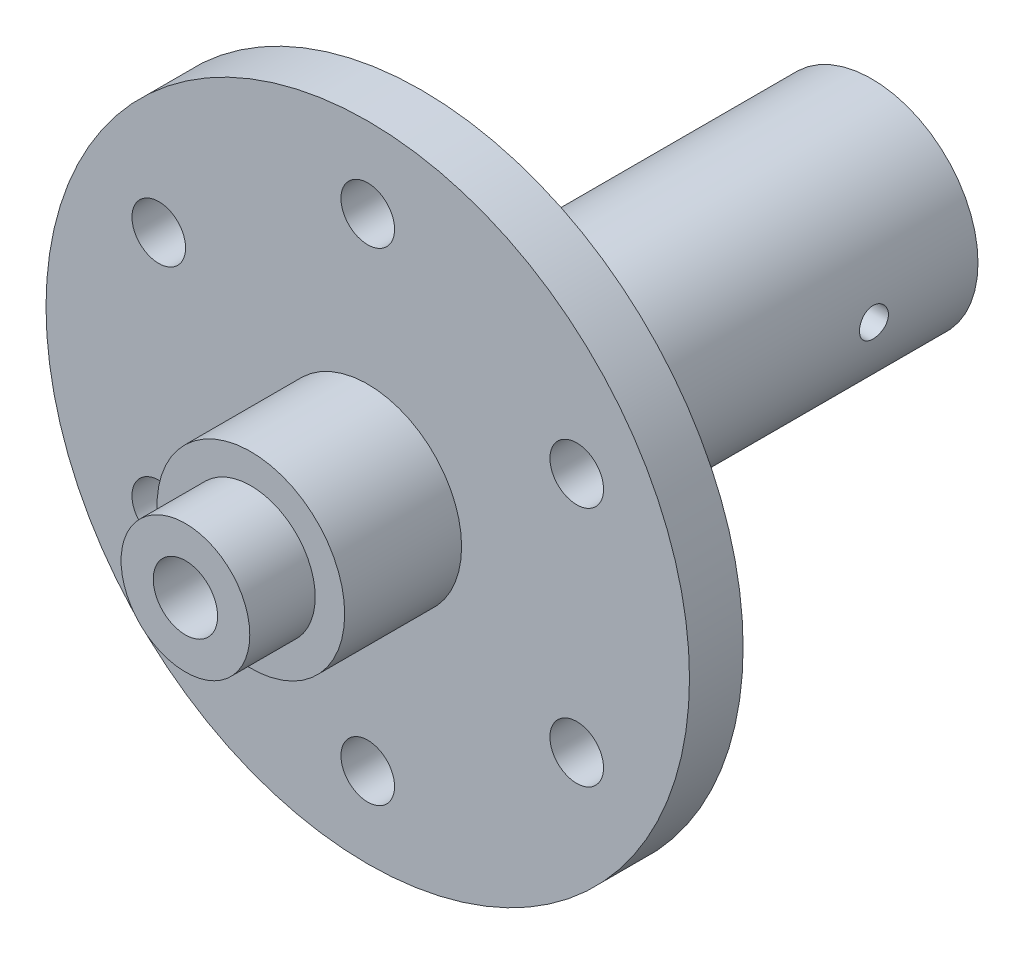
ISO-10303-21;
HEADER;
FILE_DESCRIPTION(('STEP AP214'),'2;1');
FILE_NAME('part.step','',(''),(''),'','','');
FILE_SCHEMA(('AUTOMOTIVE_DESIGN { 1 0 10303 214 1 1 1 1 }'));
ENDSEC;
DATA;
#1=APPLICATION_CONTEXT('core data for automotive mechanical design processes');
#2=APPLICATION_PROTOCOL_DEFINITION('international standard','automotive_design',2000,#1);
#3=PRODUCT_CONTEXT('',#1,'mechanical');
#4=PRODUCT('Part','Part','',(#3));
#5=PRODUCT_RELATED_PRODUCT_CATEGORY('part','',(#4));
#6=PRODUCT_DEFINITION_FORMATION('','',#4);
#7=PRODUCT_DEFINITION_CONTEXT('part definition',#1,'design');
#8=PRODUCT_DEFINITION('design','',#6,#7);
#9=PRODUCT_DEFINITION_SHAPE('','',#8);
#10=(LENGTH_UNIT() NAMED_UNIT(*) SI_UNIT(.MILLI.,.METRE.));
#11=(NAMED_UNIT(*) PLANE_ANGLE_UNIT() SI_UNIT($,.RADIAN.));
#12=(NAMED_UNIT(*) SI_UNIT($,.STERADIAN.) SOLID_ANGLE_UNIT());
#13=UNCERTAINTY_MEASURE_WITH_UNIT(LENGTH_MEASURE(1.E-05),#10,'distance_accuracy_value','');
#14=(GEOMETRIC_REPRESENTATION_CONTEXT(3) GLOBAL_UNCERTAINTY_ASSIGNED_CONTEXT((#13)) GLOBAL_UNIT_ASSIGNED_CONTEXT((#10,
#11,#12)) REPRESENTATION_CONTEXT('',''));
#15=CARTESIAN_POINT('',(0.,0.,0.));
#16=DIRECTION('',(0.,0.,1.));
#17=DIRECTION('',(1.,0.,0.));
#18=AXIS2_PLACEMENT_3D('',#15,#16,#17);
#19=CARTESIAN_POINT('',(-30.36,-30.36,5.));
#20=DIRECTION('',(0.,0.,1.));
#21=DIRECTION('',(1.,0.,0.));
#22=AXIS2_PLACEMENT_3D('',#19,#20,#21);
#23=PLANE('',#22);
#24=CARTESIAN_POINT('',(0.,0.,5.));
#25=DIRECTION('',(0.,0.,-1.));
#26=DIRECTION('',(0.,1.,0.));
#27=AXIS2_PLACEMENT_3D('',#24,#25,#26);
#28=CIRCLE('',#27,30.);
#29=CARTESIAN_POINT('',(0.,30.,5.));
#30=VERTEX_POINT('',#29);
#31=EDGE_CURVE('E123',#30,#30,#28,.F.);
#32=ORIENTED_EDGE('',*,*,#31,.T.);
#33=EDGE_LOOP('',(#32));
#34=FACE_BOUND('',#33,.T.);
#35=CARTESIAN_POINT('',(0.,-22.5,5.));
#36=DIRECTION('',(0.,0.,1.));
#37=DIRECTION('',(1.,0.,0.));
#38=AXIS2_PLACEMENT_3D('',#35,#36,#37);
#39=CIRCLE('',#38,2.5);
#40=CARTESIAN_POINT('',(2.5,-22.5,5.));
#41=VERTEX_POINT('',#40);
#42=EDGE_CURVE('E120',#41,#41,#39,.T.);
#43=ORIENTED_EDGE('',*,*,#42,.F.);
#44=EDGE_LOOP('',(#43));
#45=FACE_BOUND('',#44,.T.);
#46=CARTESIAN_POINT('',(-19.485571585,11.25,5.));
#47=DIRECTION('',(0.,0.,1.));
#48=DIRECTION('',(1.,0.,0.));
#49=AXIS2_PLACEMENT_3D('',#46,#47,#48);
#50=CIRCLE('',#49,2.5);
#51=CARTESIAN_POINT('',(-16.985571585,11.25,5.));
#52=VERTEX_POINT('',#51);
#53=EDGE_CURVE('E117',#52,#52,#50,.T.);
#54=ORIENTED_EDGE('',*,*,#53,.F.);
#55=EDGE_LOOP('',(#54));
#56=FACE_BOUND('',#55,.T.);
#57=CARTESIAN_POINT('',(19.485571585,-11.25,5.));
#58=DIRECTION('',(0.,0.,1.));
#59=DIRECTION('',(1.,0.,0.));
#60=AXIS2_PLACEMENT_3D('',#57,#58,#59);
#61=CIRCLE('',#60,2.5);
#62=CARTESIAN_POINT('',(21.985571585,-11.25,5.));
#63=VERTEX_POINT('',#62);
#64=EDGE_CURVE('E114',#63,#63,#61,.T.);
#65=ORIENTED_EDGE('',*,*,#64,.F.);
#66=EDGE_LOOP('',(#65));
#67=FACE_BOUND('',#66,.T.);
#68=CARTESIAN_POINT('',(0.,22.5,5.));
#69=DIRECTION('',(0.,0.,1.));
#70=DIRECTION('',(1.,0.,0.));
#71=AXIS2_PLACEMENT_3D('',#68,#69,#70);
#72=CIRCLE('',#71,2.5);
#73=CARTESIAN_POINT('',(2.5,22.5,5.));
#74=VERTEX_POINT('',#73);
#75=EDGE_CURVE('E111',#74,#74,#72,.T.);
#76=ORIENTED_EDGE('',*,*,#75,.F.);
#77=EDGE_LOOP('',(#76));
#78=FACE_BOUND('',#77,.T.);
#79=CARTESIAN_POINT('',(-19.485571585,-11.25,5.));
#80=DIRECTION('',(0.,0.,1.));
#81=DIRECTION('',(1.,0.,0.));
#82=AXIS2_PLACEMENT_3D('',#79,#80,#81);
#83=CIRCLE('',#82,2.5);
#84=CARTESIAN_POINT('',(-16.985571585,-11.25,5.));
#85=VERTEX_POINT('',#84);
#86=EDGE_CURVE('E108',#85,#85,#83,.T.);
#87=ORIENTED_EDGE('',*,*,#86,.F.);
#88=EDGE_LOOP('',(#87));
#89=FACE_BOUND('',#88,.T.);
#90=CARTESIAN_POINT('',(19.485571585,11.25,5.));
#91=DIRECTION('',(0.,0.,1.));
#92=DIRECTION('',(1.,0.,0.));
#93=AXIS2_PLACEMENT_3D('',#90,#91,#92);
#94=CIRCLE('',#93,2.5);
#95=CARTESIAN_POINT('',(21.985571585,11.25,5.));
#96=VERTEX_POINT('',#95);
#97=EDGE_CURVE('E105',#96,#96,#94,.T.);
#98=ORIENTED_EDGE('',*,*,#97,.F.);
#99=EDGE_LOOP('',(#98));
#100=FACE_BOUND('',#99,.T.);
#101=CARTESIAN_POINT('',(0.,0.,5.));
#102=DIRECTION('',(0.,0.,1.));
#103=DIRECTION('',(1.,0.,0.));
#104=AXIS2_PLACEMENT_3D('',#101,#102,#103);
#105=CIRCLE('',#104,8.75);
#106=CARTESIAN_POINT('',(8.75000000000001,0.,5.));
#107=VERTEX_POINT('',#106);
#108=EDGE_CURVE('E141',#107,#107,#105,.T.);
#109=ORIENTED_EDGE('',*,*,#108,.F.);
#110=EDGE_LOOP('',(#109));
#111=FACE_BOUND('',#110,.T.);
#112=ADVANCED_FACE('F35',(#34,#45,#56,#67,#78,#89,#100,#111),#23,.T.);
#113=CARTESIAN_POINT('',(0.,0.,5.));
#114=DIRECTION('',(0.,0.,1.));
#115=DIRECTION('',(0.,-1.,0.));
#116=AXIS2_PLACEMENT_3D('',#113,#114,#115);
#117=CYLINDRICAL_SURFACE('',#116,5.);
#118=DIRECTION('',(0.,0.,1.));
#119=VECTOR('',#118,1.);
#120=CARTESIAN_POINT('',(3.99999999968993,3.00000000041343,-42.));
#121=LINE('',#120,#119);
#122=CARTESIAN_POINT('',(3.99999999968993,3.00000000041343,-42.));
#123=VERTEX_POINT('',#122);
#124=CARTESIAN_POINT('',(3.99999999968993,3.00000000041343,-20.));
#125=VERTEX_POINT('',#124);
#126=EDGE_CURVE('E71',#123,#125,#121,.T.);
#127=ORIENTED_EDGE('',*,*,#126,.T.);
#128=CARTESIAN_POINT('',(0.,0.,-20.));
#129=DIRECTION('',(0.,0.,1.));
#130=DIRECTION('',(1.,0.,0.));
#131=AXIS2_PLACEMENT_3D('',#128,#129,#130);
#132=CIRCLE('',#131,5.);
#133=CARTESIAN_POINT('',(3.99999999942055,-3.0000000007726,-20.));
#134=VERTEX_POINT('',#133);
#135=EDGE_CURVE('E49',#125,#134,#132,.T.);
#136=ORIENTED_EDGE('',*,*,#135,.T.);
#137=DIRECTION('',(0.,0.,1.));
#138=VECTOR('',#137,1.);
#139=CARTESIAN_POINT('',(3.99999999942055,-3.0000000007726,-42.));
#140=LINE('',#139,#138);
#141=CARTESIAN_POINT('',(3.99999999942055,-3.0000000007726,-42.));
#142=VERTEX_POINT('',#141);
#143=EDGE_CURVE('E69',#142,#134,#140,.T.);
#144=ORIENTED_EDGE('',*,*,#143,.F.);
#145=CARTESIAN_POINT('',(0.,0.,-42.));
#146=DIRECTION('',(0.,0.,1.));
#147=DIRECTION('',(1.,0.,0.));
#148=AXIS2_PLACEMENT_3D('',#145,#146,#147);
#149=CIRCLE('',#148,5.);
#150=EDGE_CURVE('E57',#123,#142,#149,.T.);
#151=ORIENTED_EDGE('',*,*,#150,.F.);
#152=EDGE_LOOP('',(#127,#136,#144,#151));
#153=FACE_BOUND('',#152,.T.);
#154=CARTESIAN_POINT('',(-4.81430161076521,1.35000000021612,-32.3004));
#155=CARTESIAN_POINT('',(-4.81430286394878,1.34999827971691,-32.3747315823983));
#156=CARTESIAN_POINT('',(-4.81604192341821,1.34383999346028,-32.4490812209438));
#157=CARTESIAN_POINT('',(-4.82278880598046,1.31941781697971,-32.5956307548145));
#158=CARTESIAN_POINT('',(-4.82779821537384,1.30114805195241,-32.667829589101));
#159=CARTESIAN_POINT('',(-4.84047800968983,1.25314927820912,-32.8079362165503));
#160=CARTESIAN_POINT('',(-4.84814458741225,1.22343665812198,-32.8758499856834));
#161=CARTESIAN_POINT('',(-4.86527000640674,1.1534472112701,-33.0057400337567));
#162=CARTESIAN_POINT('',(-4.87472899967937,1.11316948845133,-33.067715808471));
#163=CARTESIAN_POINT('',(-4.89464524575246,1.02208874803816,-33.1855596541482));
#164=CARTESIAN_POINT('',(-4.90512055048185,0.971063477685963,-33.2412529330843));
#165=CARTESIAN_POINT('',(-4.92573346298987,0.860413894712616,-33.3434045809951));
#166=CARTESIAN_POINT('',(-4.93587103491721,0.800788672739945,-33.3898619721379));
#167=CARTESIAN_POINT('',(-4.95486803593727,0.673416712616414,-33.4729548187037));
#168=CARTESIAN_POINT('',(-4.96370368888867,0.605552481827099,-33.5094160794056));
#169=CARTESIAN_POINT('',(-4.97889393890284,0.464378551427537,-33.5703449097957));
#170=CARTESIAN_POINT('',(-4.98524896522513,0.391069796579459,-33.5948145547579));
#171=CARTESIAN_POINT('',(-4.99463427073677,0.242912677048861,-33.6304986374292));
#172=CARTESIAN_POINT('',(-4.99773903427427,0.168140751372819,-33.6420105085242));
#173=CARTESIAN_POINT('',(-5.00053459517465,0.0176667620460513,-33.652388490739));
#174=CARTESIAN_POINT('',(-5.00022597775716,-0.0580351399383997,-33.6512567695858));
#175=CARTESIAN_POINT('',(-4.99628394181706,-0.206148379146274,-33.6365882168669));
#176=CARTESIAN_POINT('',(-4.99273667294193,-0.278594192255634,-33.6233728036255));
#177=CARTESIAN_POINT('',(-4.9828178523946,-0.420198991039629,-33.5854318141791));
#178=CARTESIAN_POINT('',(-4.97644613767504,-0.489357786708727,-33.5607055734822));
#179=CARTESIAN_POINT('',(-4.96146740611882,-0.623240499431479,-33.5002012573594));
#180=CARTESIAN_POINT('',(-4.95283843209469,-0.687912484550364,-33.4643139273697));
#181=CARTESIAN_POINT('',(-4.93427357589745,-0.810425309308604,-33.3825902231744));
#182=CARTESIAN_POINT('',(-4.92433743361614,-0.868264785015195,-33.3367518676705));
#183=CARTESIAN_POINT('',(-4.90386504530922,-0.977389368577139,-33.2347246747745));
#184=CARTESIAN_POINT('',(-4.89331975390705,-1.02841112295466,-33.178255646644));
#185=CARTESIAN_POINT('',(-4.87309871985228,-1.12032576120185,-33.05745407588));
#186=CARTESIAN_POINT('',(-4.86342303303649,-1.16121799495637,-32.9931210289274));
#187=CARTESIAN_POINT('',(-4.84599972165287,-1.23192009263183,-32.8578350851013));
#188=CARTESIAN_POINT('',(-4.83826495492739,-1.26165666485418,-32.7868421121628));
#189=CARTESIAN_POINT('',(-4.82575813869753,-1.30868526983732,-32.6406031190618));
#190=CARTESIAN_POINT('',(-4.82098533319036,-1.32598047827686,-32.5653581895109));
#191=CARTESIAN_POINT('',(-4.81510437101878,-1.34717781685081,-32.4152183648038));
#192=CARTESIAN_POINT('',(-4.81388856469176,-1.35147350921993,-32.3403831903031));
#193=CARTESIAN_POINT('',(-4.81496442602068,-1.3476356241933,-32.1910634834604));
#194=CARTESIAN_POINT('',(-4.81725570969025,-1.33950340751207,-32.1165789136269));
#195=CARTESIAN_POINT('',(-4.82498343552624,-1.31138786804745,-31.9716027701404));
#196=CARTESIAN_POINT('',(-4.83035662118218,-1.29164270168572,-31.9010613090276));
#197=CARTESIAN_POINT('',(-4.84358057255287,-1.24113031958282,-31.7642918346376));
#198=CARTESIAN_POINT('',(-4.85143166777493,-1.2103616378837,-31.6980643964441));
#199=CARTESIAN_POINT('',(-4.86894659996756,-1.13788170222456,-31.5701606919066));
#200=CARTESIAN_POINT('',(-4.87864718962229,-1.09594020593687,-31.5086200482754));
#201=CARTESIAN_POINT('',(-4.89868236925265,-1.00258944509475,-31.3933058237614));
#202=CARTESIAN_POINT('',(-4.90901708126084,-0.95117835434602,-31.3395337446074));
#203=CARTESIAN_POINT('',(-4.92952783932558,-0.838524492135215,-31.239641046785));
#204=CARTESIAN_POINT('',(-4.93969004119957,-0.777034931652404,-31.1937953280814));
#205=CARTESIAN_POINT('',(-4.95839615108514,-0.647005001729556,-31.1130756697437));
#206=CARTESIAN_POINT('',(-4.96694014524872,-0.578465007948501,-31.0782011459472));
#207=CARTESIAN_POINT('',(-4.98139207314967,-0.436762281090105,-31.0207367642324));
#208=CARTESIAN_POINT('',(-4.98731971513465,-0.363639019110184,-30.9980547706832));
#209=CARTESIAN_POINT('',(-4.99595786013535,-0.214434383633308,-30.9653542568033));
#210=CARTESIAN_POINT('',(-4.99866909541368,-0.138353687515078,-30.9553328540679));
#211=CARTESIAN_POINT('',(-5.00053340347862,0.012040739540617,-30.9484223339653));
#212=CARTESIAN_POINT('',(-4.99979560961114,0.0863348693302916,-30.9511304475152));
#213=CARTESIAN_POINT('',(-4.9950925506781,0.233369155458227,-30.9686642677354));
#214=CARTESIAN_POINT('',(-4.99112741227251,0.306109372666173,-30.9834894988588));
#215=CARTESIAN_POINT('',(-4.98043780455775,0.447473612222866,-31.0246067106959));
#216=CARTESIAN_POINT('',(-4.97373345825575,0.516123555072634,-31.0508151537865));
#217=CARTESIAN_POINT('',(-4.95826558945786,0.648090737389069,-31.1138803569012));
#218=CARTESIAN_POINT('',(-4.94950177267119,0.711407212964617,-31.1507386389211));
#219=CARTESIAN_POINT('',(-4.93055366445352,0.832777843171191,-31.2352258248417));
#220=CARTESIAN_POINT('',(-4.92033721707041,0.890641992186854,-31.2831204470282));
#221=CARTESIAN_POINT('',(-4.89976261729472,0.997648040240388,-31.3878192585778));
#222=CARTESIAN_POINT('',(-4.88940442802242,1.04678762090709,-31.4446258085679));
#223=CARTESIAN_POINT('',(-4.86944773346185,1.13605588603213,-31.5670873168881));
#224=CARTESIAN_POINT('',(-4.85987181512871,1.17595465944405,-31.6329138859785));
#225=CARTESIAN_POINT('',(-4.84288629979928,1.24406289798214,-31.7705912328054));
#226=CARTESIAN_POINT('',(-4.83547532076067,1.27227982532403,-31.8424381294499));
#227=CARTESIAN_POINT('',(-4.82466037217815,1.31263646017289,-31.9783907221685));
#228=CARTESIAN_POINT('',(-4.82080774030971,1.32661438042155,-32.0419208716674));
#229=CARTESIAN_POINT('',(-4.81562796422291,1.34529634267034,-32.1704295300676));
#230=CARTESIAN_POINT('',(-4.81430051503879,1.35000150454197,-32.2354078631131));
#231=CARTESIAN_POINT('',(-4.81430161076521,1.35000000021612,-32.3004));
#232=B_SPLINE_CURVE_WITH_KNOTS('',3,(#154,#155,#156,#157,#158,#159,#160,#161,#162,#163,#164,
#165,#166,#167,#168,#169,#170,#171,#172,#173,#174,#175,#176,#177,#178,#179,#180,#181,#182,#183,
#184,#185,#186,#187,#188,#189,#190,#191,#192,#193,#194,#195,#196,#197,#198,#199,#200,#201,#202,
#203,#204,#205,#206,#207,#208,#209,#210,#211,#212,#213,#214,#215,#216,#217,#218,#219,#220,#221,
#222,#223,#224,#225,#226,#227,#228,#229,#230,#231),.UNSPECIFIED.,.T.,.F.,(4,2,2,2,2,2,2,2,2,2,2,
2,2,2,2,2,2,2,2,2,2,2,2,2,2,2,2,2,2,2,2,2,2,2,2,2,2,2,4),(0.,0.222755692343451,
0.445619513874613,0.668165326449917,0.890730019824896,1.11845165869997,1.34619739434281,
1.57769059856956,1.8091437263254,2.03516823266293,2.26115398799988,2.48129819326814,
2.70145510849998,2.9238388082141,3.1462668262969,3.37569041153007,3.60512871741316,
3.83604905822631,4.06691043530417,4.29070879096954,4.51448264501875,4.7338199612218,
4.95318645674709,5.17747977382431,5.4018163908385,5.63282035090824,5.86381200906635,
6.09303267142768,6.3222011382911,6.54416828930886,6.76612672945205,6.9864831070752,
7.20687099198435,7.43325409621117,7.65969726726047,7.89128155572097,8.12271768195437,
8.31750860033477,8.51227599236394),.UNSPECIFIED.);
#233=CARTESIAN_POINT('',(-4.81430161076521,1.35000000021612,-32.3004));
#234=VERTEX_POINT('',#233);
#235=EDGE_CURVE('E175',#234,#234,#232,.T.);
#236=ORIENTED_EDGE('',*,*,#235,.T.);
#237=EDGE_LOOP('',(#236));
#238=FACE_BOUND('',#237,.T.);
#239=ADVANCED_FACE('F67',(#153,#238),#117,.F.);
#240=CARTESIAN_POINT('',(0.,0.,-42.));
#241=DIRECTION('',(0.,0.,1.));
#242=DIRECTION('',(1.,0.,0.));
#243=AXIS2_PLACEMENT_3D('',#240,#241,#242);
#244=CYLINDRICAL_SURFACE('',#243,9.9);
#245=CARTESIAN_POINT('',(-9.80752262290591,1.3500000004403,-32.3004));
#246=CARTESIAN_POINT('',(-9.8075237907215,1.34999682973092,-32.2249491048984));
#247=CARTESIAN_POINT('',(-9.8084027176473,1.34365326126944,-32.1494525015093));
#248=CARTESIAN_POINT('',(-9.8118216762799,1.31845018826125,-32.0005645727839));
#249=CARTESIAN_POINT('',(-9.81436339375965,1.29957798162359,-31.9271754629777));
#250=CARTESIAN_POINT('',(-9.82081481492152,1.2498879857603,-31.7846794930372));
#251=CARTESIAN_POINT('',(-9.82472353753646,1.21907876174358,-31.7155696035645));
#252=CARTESIAN_POINT('',(-9.83346738097157,1.14640846379892,-31.5835122281274));
#253=CARTESIAN_POINT('',(-9.83830235677538,1.1045491195163,-31.5205637798412));
#254=CARTESIAN_POINT('',(-9.84838983472961,1.01066967741749,-31.4021868645134));
#255=CARTESIAN_POINT('',(-9.85364464327611,0.958590785264125,-31.3468052156977));
#256=CARTESIAN_POINT('',(-9.86395903309893,0.845877353783884,-31.2455389748829));
#257=CARTESIAN_POINT('',(-9.86901860421927,0.785242370143853,-31.1996548763918));
#258=CARTESIAN_POINT('',(-9.87839630202051,0.656841030582761,-31.118516035593));
#259=CARTESIAN_POINT('',(-9.88271141992098,0.58904744215384,-31.0833040110853));
#260=CARTESIAN_POINT('',(-9.89008857393079,0.448440102274003,-31.0247826887022));
#261=CARTESIAN_POINT('',(-9.89315066503237,0.37562657129982,-31.0014728684574));
#262=CARTESIAN_POINT('',(-9.89766049322655,0.227526762876686,-30.9675584712306));
#263=CARTESIAN_POINT('',(-9.89911815259046,0.152258681785508,-30.9568757737337));
#264=CARTESIAN_POINT('',(-9.9002888172146,0.000985059398865145,-30.9482765571324));
#265=CARTESIAN_POINT('',(-9.90000190338879,-0.075020447531275,-30.9503594459553));
#266=CARTESIAN_POINT('',(-9.8977237332072,-0.225079259898616,-30.9671700848278));
#267=CARTESIAN_POINT('',(-9.89574380291213,-0.299142175011291,-30.9818138065643));
#268=CARTESIAN_POINT('',(-9.89031472276806,-0.443749485452788,-31.0231988409142));
#269=CARTESIAN_POINT('',(-9.88686554059641,-0.514293803336486,-31.0499404196738));
#270=CARTESIAN_POINT('',(-9.87886598608269,-0.650119050531565,-31.1148499822409));
#271=CARTESIAN_POINT('',(-9.87431215938429,-0.715382595299201,-31.1530539007143));
#272=CARTESIAN_POINT('',(-9.86461195934913,-0.838604096288644,-31.2397774945077));
#273=CARTESIAN_POINT('',(-9.85946555371228,-0.896561653917172,-31.2882977322683));
#274=CARTESIAN_POINT('',(-9.84910588723563,-1.00402037561065,-31.3947462053283));
#275=CARTESIAN_POINT('',(-9.84389242304821,-1.05344894513414,-31.4527477327581));
#276=CARTESIAN_POINT('',(-9.83402731956033,-1.14188123690315,-31.5762617634032));
#277=CARTESIAN_POINT('',(-9.82937568268039,-1.18088491423574,-31.6417742989759));
#278=CARTESIAN_POINT('',(-9.82116103951353,-1.24736683064465,-31.7785201057209));
#279=CARTESIAN_POINT('',(-9.81759864985566,-1.27483854467972,-31.8497565885459));
#280=CARTESIAN_POINT('',(-9.81197736911502,-1.31740861283488,-31.9958913275152));
#281=CARTESIAN_POINT('',(-9.8099183912274,-1.33250768133999,-32.0707893719797));
#282=CARTESIAN_POINT('',(-9.80755321007123,-1.34980623708423,-32.2214779591562));
#283=CARTESIAN_POINT('',(-9.80723308190031,-1.35210820840674,-32.2972565264576));
#284=CARTESIAN_POINT('',(-9.80834495931234,-1.3440182948786,-32.4481182761399));
#285=CARTESIAN_POINT('',(-9.80977692023903,-1.33362673355352,-32.5232014761948));
#286=CARTESIAN_POINT('',(-9.81421888828193,-1.30053129910138,-32.670229559321));
#287=CARTESIAN_POINT('',(-9.81722245414044,-1.27787766936495,-32.7421859634716));
#288=CARTESIAN_POINT('',(-9.82446394922221,-1.22095310497074,-32.8812795521668));
#289=CARTESIAN_POINT('',(-9.82870192952664,-1.18668168954903,-32.9484165371362));
#290=CARTESIAN_POINT('',(-9.83796786355063,-1.10724490850025,-33.0764273456004));
#291=CARTESIAN_POINT('',(-9.84300059500141,-1.06201271001089,-33.1372593445137));
#292=CARTESIAN_POINT('',(-9.85327424254691,-0.962032133017785,-33.2505052521909));
#293=CARTESIAN_POINT('',(-9.85851516830816,-0.90728331225488,-33.3029187695108));
#294=CARTESIAN_POINT('',(-9.86865778983748,-0.789374328263173,-33.3982033741284));
#295=CARTESIAN_POINT('',(-9.87355692523932,-0.726159289275139,-33.4410068680163));
#296=CARTESIAN_POINT('',(-9.88242505211357,-0.593377035595116,-33.5153873001349));
#297=CARTESIAN_POINT('',(-9.88639406531546,-0.523809969351697,-33.5469645006429));
#298=CARTESIAN_POINT('',(-9.89294345091013,-0.38051712723461,-33.5978859233357));
#299=CARTESIAN_POINT('',(-9.89552815000339,-0.306805114152615,-33.6172682942818));
#300=CARTESIAN_POINT('',(-9.89903573690093,-0.15713510608504,-33.6433737069085));
#301=CARTESIAN_POINT('',(-9.89995871464042,-0.0811772328754583,-33.6500974336977));
#302=CARTESIAN_POINT('',(-9.9000382351372,0.0701702756016595,-33.6506801994941));
#303=CARTESIAN_POINT('',(-9.89920904054683,0.145559524290572,-33.6446431111945));
#304=CARTESIAN_POINT('',(-9.89590590334072,0.294240837821264,-33.6200967609253));
#305=CARTESIAN_POINT('',(-9.89343196350037,0.367532906201682,-33.6015875200017));
#306=CARTESIAN_POINT('',(-9.88711599954709,0.50991924539026,-33.5526567664839));
#307=CARTESIAN_POINT('',(-9.8832746584634,0.579015591864678,-33.5222412004516));
#308=CARTESIAN_POINT('',(-9.87464775232686,0.711140217226452,-33.4503720279836));
#309=CARTESIAN_POINT('',(-9.86986216751184,0.77416836907095,-33.4089181905206));
#310=CARTESIAN_POINT('',(-9.85983358786315,0.892896628314655,-33.3157684919498));
#311=CARTESIAN_POINT('',(-9.85458732810588,0.948535996661348,-33.2639955588355));
#312=CARTESIAN_POINT('',(-9.84425400227595,1.05037626859503,-33.1518388098082));
#313=CARTESIAN_POINT('',(-9.83916697402016,1.09657494424181,-33.0914529670022));
#314=CARTESIAN_POINT('',(-9.82970308067298,1.17840876065483,-32.9634616379826));
#315=CARTESIAN_POINT('',(-9.82532959115724,1.21399431441518,-32.8958242087542));
#316=CARTESIAN_POINT('',(-9.81782746569491,1.27324931444519,-32.7555085868851));
#317=CARTESIAN_POINT('',(-9.81469750328762,1.29693146517287,-32.6828358630941));
#318=CARTESIAN_POINT('',(-9.8107809878368,1.32616441495745,-32.558239741585));
#319=CARTESIAN_POINT('',(-9.80956535408582,1.33508955547523,-32.5070956099229));
#320=CARTESIAN_POINT('',(-9.80793577414292,1.34700840913097,-32.404108180294));
#321=CARTESIAN_POINT('',(-9.80752182015034,1.35000217998358,-32.3522648891352));
#322=CARTESIAN_POINT('',(-9.80752262290591,1.3500000004403,-32.3004));
#323=B_SPLINE_CURVE_WITH_KNOTS('',3,(#245,#246,#247,#248,#249,#250,#251,#252,#253,#254,#255,
#256,#257,#258,#259,#260,#261,#262,#263,#264,#265,#266,#267,#268,#269,#270,#271,#272,#273,#274,
#275,#276,#277,#278,#279,#280,#281,#282,#283,#284,#285,#286,#287,#288,#289,#290,#291,#292,#293,
#294,#295,#296,#297,#298,#299,#300,#301,#302,#303,#304,#305,#306,#307,#308,#309,#310,#311,#312,
#313,#314,#315,#316,#317,#318,#319,#320,#321,#322),.UNSPECIFIED.,.T.,.F.,(4,2,2,2,2,2,2,2,2,2,2,
2,2,2,2,2,2,2,2,2,2,2,2,2,2,2,2,2,2,2,2,2,2,2,2,2,2,2,4),(0.,0.226163172287117,
0.452555989753271,0.678786662749016,0.904981945446979,1.13251887157327,1.36006761791909,
1.58851551172085,1.81695337843619,2.04397044034523,2.27097697319949,2.49647663766075,
2.72198126323256,2.94820037157923,3.17443181644188,3.40250284180547,3.63057484973815,
3.8587757325033,4.08696343823385,4.31332106739138,4.53967292739433,4.7651042630056,
4.99054492849167,5.2173964162768,5.44425844918844,5.67266936550448,5.90107494516211,
6.1287624098994,6.35643755142767,6.5822665633283,6.808095194158,7.03381117947648,
7.25953188932555,7.48700631200962,7.71453435529503,7.94310938333473,8.1714399332986,
8.32690584235141,8.48237023864965),.UNSPECIFIED.);
#324=CARTESIAN_POINT('',(-9.80752262290591,1.3500000004403,-32.3004));
#325=VERTEX_POINT('',#324);
#326=EDGE_CURVE('E133',#325,#325,#323,.T.);
#327=ORIENTED_EDGE('',*,*,#326,.T.);
#328=EDGE_LOOP('',(#327));
#329=FACE_BOUND('',#328,.T.);
#330=CARTESIAN_POINT('',(0.,0.,-42.));
#331=DIRECTION('',(0.,0.,1.));
#332=DIRECTION('',(1.,0.,0.));
#333=AXIS2_PLACEMENT_3D('',#330,#331,#332);
#334=CIRCLE('',#333,9.9);
#335=CARTESIAN_POINT('',(9.9,0.,-42.));
#336=VERTEX_POINT('',#335);
#337=EDGE_CURVE('E78',#336,#336,#334,.T.);
#338=ORIENTED_EDGE('',*,*,#337,.T.);
#339=EDGE_LOOP('',(#338));
#340=FACE_BOUND('',#339,.T.);
#341=CARTESIAN_POINT('',(0.,0.,0.));
#342=DIRECTION('',(0.,0.,1.));
#343=DIRECTION('',(1.,0.,0.));
#344=AXIS2_PLACEMENT_3D('',#341,#342,#343);
#345=CIRCLE('',#344,9.9);
#346=CARTESIAN_POINT('',(9.9,0.,0.));
#347=VERTEX_POINT('',#346);
#348=EDGE_CURVE('E84',#347,#347,#345,.T.);
#349=ORIENTED_EDGE('',*,*,#348,.F.);
#350=EDGE_LOOP('',(#349));
#351=FACE_BOUND('',#350,.T.);
#352=CARTESIAN_POINT('',(9.9,0.,-33.6504));
#353=CARTESIAN_POINT('',(9.89999887205355,-0.0754545720863779,-33.6503968325132));
#354=CARTESIAN_POINT('',(9.89912828443389,-0.150954842061865,-33.6440526666445));
#355=CARTESIAN_POINT('',(9.89573909767583,-0.299850387885685,-33.6188470051973));
#356=CARTESIAN_POINT('',(9.89321882796041,-0.37324345110802,-33.5999728206187));
#357=CARTESIAN_POINT('',(9.88681389658311,-0.515747784353827,-33.5502770397144));
#358=CARTESIAN_POINT('',(9.88293020255048,-0.584862050247202,-33.5194639149122));
#359=CARTESIAN_POINT('',(9.87422915449622,-0.716926772267123,-33.4467844281341));
#360=CARTESIAN_POINT('',(9.86941194740461,-0.779878196048578,-33.4049198052305));
#361=CARTESIAN_POINT('',(9.85934573971373,-0.898251807536771,-33.3110350074364));
#362=CARTESIAN_POINT('',(9.85409439213525,-0.953628106283827,-33.2589572196152));
#363=CARTESIAN_POINT('',(9.84377044401696,-1.05488400533118,-33.14624825064));
#364=CARTESIAN_POINT('',(9.83869785308735,-1.10076309569365,-33.0856166104939));
#365=CARTESIAN_POINT('',(9.82928283992048,-1.18189665494508,-32.9572182559952));
#366=CARTESIAN_POINT('',(9.82494344706714,-1.21710749845897,-32.889423733904));
#367=CARTESIAN_POINT('',(9.81751764657219,-1.27562638065772,-32.7488143665921));
#368=CARTESIAN_POINT('',(9.81443118251409,-1.29893495528639,-32.6759997475874));
#369=CARTESIAN_POINT('',(9.80988344718008,-1.33284681536,-32.5278963812308));
#370=CARTESIAN_POINT('',(9.80841220396708,-1.34352809017038,-32.452625803088));
#371=CARTESIAN_POINT('',(9.80723109418274,-1.35212359597705,-32.3013472747298));
#372=CARTESIAN_POINT('',(9.80752114373366,-1.35003843494719,-32.2253393598006));
#373=CARTESIAN_POINT('',(9.80982072295896,-1.33322415368851,-32.0752904474027));
#374=CARTESIAN_POINT('',(9.81181851384505,-1.31858135079833,-32.001239571708));
#375=CARTESIAN_POINT('',(9.81729015659706,-1.27720230984584,-31.8566558639447));
#376=CARTESIAN_POINT('',(9.82076404353158,-1.25046578446388,-31.7861231155033));
#377=CARTESIAN_POINT('',(9.82880962456397,-1.18556677649894,-31.6503120669597));
#378=CARTESIAN_POINT('',(9.83338487340241,-1.14736719539906,-31.5850517140401));
#379=CARTESIAN_POINT('',(9.8431149989344,-1.06065290812462,-31.4618347663561));
#380=CARTESIAN_POINT('',(9.84826990713334,-1.01213764114852,-31.4038785689475));
#381=CARTESIAN_POINT('',(9.8586305764366,-0.905692750832437,-31.2964144012577));
#382=CARTESIAN_POINT('',(9.8638364064013,-0.847688806456191,-31.2469800240025));
#383=CARTESIAN_POINT('',(9.87367272345942,-0.724167850791183,-31.1585371578044));
#384=CARTESIAN_POINT('',(9.87830320875972,-0.658650816088273,-31.1195287013545));
#385=CARTESIAN_POINT('',(9.88647078674376,-0.521903673395481,-31.0530433233134));
#386=CARTESIAN_POINT('',(9.89000739849645,-0.450671069790369,-31.0255714719979));
#387=CARTESIAN_POINT('',(9.89558455680029,-0.304544780032096,-30.9829999459511));
#388=CARTESIAN_POINT('',(9.89762518680212,-0.229651298343159,-30.9678995810928));
#389=CARTESIAN_POINT('',(9.89996952422661,-0.0789650175269396,-30.9505961239174));
#390=CARTESIAN_POINT('',(9.90028687221098,-0.00318405364526595,-30.9482917422713));
#391=CARTESIAN_POINT('',(9.89918584895217,0.147683063788155,-30.9563776904485));
#392=CARTESIAN_POINT('',(9.89776752188453,0.222769234974409,-30.9667676971805));
#393=CARTESIAN_POINT('',(9.89336297395404,0.369813039652342,-30.9998633007659));
#394=CARTESIAN_POINT('',(9.89038296114874,0.441781847690056,-31.0225201458675));
#395=CARTESIAN_POINT('',(9.8831883966227,0.58089882613682,-31.0794552829367));
#396=CARTESIAN_POINT('',(9.87897379586783,0.648046804945062,-31.1137340365003));
#397=CARTESIAN_POINT('',(9.86974526738817,0.776065402872879,-31.1931817845936));
#398=CARTESIAN_POINT('',(9.86472663358157,0.836895354721378,-31.2384157522417));
#399=CARTESIAN_POINT('',(9.85446497835781,0.950136311165449,-31.3383986198444));
#400=CARTESIAN_POINT('',(9.84922194627332,1.00254691496234,-31.3931479725158));
#401=CARTESIAN_POINT('',(9.83905981903616,1.09782479588071,-31.5110557493397));
#402=CARTESIAN_POINT('',(9.83414317518877,1.14062459674072,-31.5742689417505));
#403=CARTESIAN_POINT('',(9.82523218547673,1.21499855530299,-31.7070464765218));
#404=CARTESIAN_POINT('',(9.82123781823949,1.24657297314828,-31.7766106716539));
#405=CARTESIAN_POINT('',(9.81464082542124,1.29749264497792,-31.91990498057));
#406=CARTESIAN_POINT('',(9.81203399914781,1.31687484290666,-31.9936217645507));
#407=CARTESIAN_POINT('',(9.8084955885096,1.34297829443471,-32.1433018691956));
#408=CARTESIAN_POINT('',(9.80756391007118,1.34970025901366,-32.2192650634616));
#409=CARTESIAN_POINT('',(9.80748436879488,1.35027770884556,-32.3706098774014));
#410=CARTESIAN_POINT('',(9.80832180481214,1.34423923182389,-32.4459911064997));
#411=CARTESIAN_POINT('',(9.81165438052889,1.31969291760412,-32.59465602439));
#412=CARTESIAN_POINT('',(9.81414951928233,1.30118508752211,-32.6679397143791));
#413=CARTESIAN_POINT('',(9.8205115574127,1.25226050778256,-32.8103086250311));
#414=CARTESIAN_POINT('',(9.82437775238452,1.22184987257732,-32.8793959803286));
#415=CARTESIAN_POINT('',(9.83304730014443,1.14999335834695,-33.0115046683635));
#416=CARTESIAN_POINT('',(9.83785067341674,1.10854723810819,-33.0745258684658));
#417=CARTESIAN_POINT('',(9.84790106931145,1.01540623686316,-33.1932540326014));
#418=CARTESIAN_POINT('',(9.85315131505546,0.963632505684784,-33.2488988722786));
#419=CARTESIAN_POINT('',(9.8634760857398,0.851471881156971,-33.3507498117547));
#420=CARTESIAN_POINT('',(9.86855056924337,0.791082973686579,-33.396953698215));
#421=CARTESIAN_POINT('',(9.87797783673242,0.663088943833965,-33.4787933704224));
#422=CARTESIAN_POINT('',(9.88232725481271,0.595452436629558,-33.5143804422488));
#423=CARTESIAN_POINT('',(9.88978083351513,0.455138724520802,-33.5736385327949));
#424=CARTESIAN_POINT('',(9.89288631924981,0.382466980811032,-33.5973222385959));
#425=CARTESIAN_POINT('',(9.89677058460578,0.257866737378038,-33.6265593932713));
#426=CARTESIAN_POINT('',(9.89797557850976,0.206717209827524,-33.6354864246487));
#427=CARTESIAN_POINT('',(9.89959067016644,0.103718982284227,-33.6474077888488));
#428=CARTESIAN_POINT('',(9.90000077539248,0.0518702888694391,-33.6504021774487));
#429=CARTESIAN_POINT('',(9.9,0.,-33.6504));
#430=B_SPLINE_CURVE_WITH_KNOTS('',3,(#352,#353,#354,#355,#356,#357,#358,#359,#360,#361,#362,
#363,#364,#365,#366,#367,#368,#369,#370,#371,#372,#373,#374,#375,#376,#377,#378,#379,#380,#381,
#382,#383,#384,#385,#386,#387,#388,#389,#390,#391,#392,#393,#394,#395,#396,#397,#398,#399,#400,
#401,#402,#403,#404,#405,#406,#407,#408,#409,#410,#411,#412,#413,#414,#415,#416,#417,#418,#419,
#420,#421,#422,#423,#424,#425,#426,#427,#428,#429),.UNSPECIFIED.,.T.,.F.,(4,2,2,2,2,2,2,2,2,2,2,
2,2,2,2,2,2,2,2,2,2,2,2,2,2,2,2,2,2,2,2,2,2,2,2,2,2,2,4),(0.,0.226174219276044,
0.452577832583527,0.678821089833299,0.90502876646877,1.13255123281771,1.36008591246484,
1.58853886133521,1.81698152235651,2.04400576799863,2.27101920218684,2.49648460985017,
2.72195537434607,2.94816385965972,3.1743846457086,3.40247056271281,3.630557190554,
3.85874395659426,4.08691799267234,4.31328326583758,4.53964277778808,4.76510920928155,
4.99058459684066,5.21743146927435,5.44428913743712,5.67269293615539,5.90109144137669,
6.12879449403649,6.35648475885445,6.58229038870063,6.80809588968238,7.03378554665144,
7.25948013714989,7.48696881189153,7.71451075807502,7.94308123821274,8.17140757943931,
8.3268896405591,8.48237023986907),.UNSPECIFIED.);
#431=CARTESIAN_POINT('',(9.9,0.,-33.6504));
#432=VERTEX_POINT('',#431);
#433=EDGE_CURVE('E138',#432,#432,#430,.T.);
#434=ORIENTED_EDGE('',*,*,#433,.T.);
#435=EDGE_LOOP('',(#434));
#436=FACE_BOUND('',#435,.T.);
#437=ADVANCED_FACE('F157',(#329,#340,#351,#436),#244,.T.);
#438=CARTESIAN_POINT('',(0.,0.,4.99999999999998));
#439=DIRECTION('',(0.,0.,1.));
#440=DIRECTION('',(1.,0.,0.));
#441=AXIS2_PLACEMENT_3D('',#438,#439,#440);
#442=CYLINDRICAL_SURFACE('',#441,6.);
#443=CARTESIAN_POINT('',(0.,0.,15.9));
#444=DIRECTION('',(0.,0.,1.));
#445=DIRECTION('',(1.,0.,0.));
#446=AXIS2_PLACEMENT_3D('',#443,#444,#445);
#447=CIRCLE('',#446,6.);
#448=CARTESIAN_POINT('',(6.00000000000001,0.,15.9));
#449=VERTEX_POINT('',#448);
#450=EDGE_CURVE('E11',#449,#449,#447,.F.);
#451=ORIENTED_EDGE('',*,*,#450,.F.);
#452=EDGE_LOOP('',(#451));
#453=FACE_BOUND('',#452,.T.);
#454=CARTESIAN_POINT('',(0.,0.,22.));
#455=DIRECTION('',(0.,0.,1.));
#456=DIRECTION('',(1.,0.,0.));
#457=AXIS2_PLACEMENT_3D('',#454,#455,#456);
#458=CIRCLE('',#457,6.);
#459=CARTESIAN_POINT('',(6.00000000000001,0.,22.));
#460=VERTEX_POINT('',#459);
#461=EDGE_CURVE('E130',#460,#460,#458,.T.);
#462=ORIENTED_EDGE('',*,*,#461,.F.);
#463=EDGE_LOOP('',(#462));
#464=FACE_BOUND('',#463,.T.);
#465=ADVANCED_FACE('F219',(#453,#464),#442,.T.);
#466=CARTESIAN_POINT('',(0.,0.,-20.));
#467=DIRECTION('',(0.,0.,1.));
#468=DIRECTION('',(1.,0.,0.));
#469=AXIS2_PLACEMENT_3D('',#466,#467,#468);
#470=CYLINDRICAL_SURFACE('',#469,3.);
#471=CARTESIAN_POINT('',(0.,0.,-20.));
#472=DIRECTION('',(0.,0.,1.));
#473=DIRECTION('',(1.,0.,0.));
#474=AXIS2_PLACEMENT_3D('',#471,#472,#473);
#475=CIRCLE('',#474,3.);
#476=CARTESIAN_POINT('',(3.,0.,-20.));
#477=VERTEX_POINT('',#476);
#478=EDGE_CURVE('E72',#477,#477,#475,.T.);
#479=ORIENTED_EDGE('',*,*,#478,.F.);
#480=EDGE_LOOP('',(#479));
#481=FACE_BOUND('',#480,.T.);
#482=CARTESIAN_POINT('',(0.,0.,22.));
#483=DIRECTION('',(0.,0.,1.));
#484=DIRECTION('',(1.,0.,0.));
#485=AXIS2_PLACEMENT_3D('',#482,#483,#484);
#486=CIRCLE('',#485,3.);
#487=CARTESIAN_POINT('',(3.,0.,22.));
#488=VERTEX_POINT('',#487);
#489=EDGE_CURVE('E128',#488,#488,#486,.F.);
#490=ORIENTED_EDGE('',*,*,#489,.F.);
#491=EDGE_LOOP('',(#490));
#492=FACE_BOUND('',#491,.T.);
#493=ADVANCED_FACE('F222',(#481,#492),#470,.F.);
#494=CARTESIAN_POINT('',(0.,0.,5.));
#495=DIRECTION('',(0.,0.,-1.));
#496=DIRECTION('',(0.,1.,0.));
#497=AXIS2_PLACEMENT_3D('',#494,#495,#496);
#498=CYLINDRICAL_SURFACE('',#497,30.);
#499=ORIENTED_EDGE('',*,*,#31,.F.);
#500=EDGE_LOOP('',(#499));
#501=FACE_BOUND('',#500,.T.);
#502=CARTESIAN_POINT('',(0.,0.,0.));
#503=DIRECTION('',(0.,0.,-1.));
#504=DIRECTION('',(0.,1.,0.));
#505=AXIS2_PLACEMENT_3D('',#502,#503,#504);
#506=CIRCLE('',#505,30.);
#507=CARTESIAN_POINT('',(0.,30.,0.));
#508=VERTEX_POINT('',#507);
#509=EDGE_CURVE('E102',#508,#508,#506,.F.);
#510=ORIENTED_EDGE('',*,*,#509,.T.);
#511=EDGE_LOOP('',(#510));
#512=FACE_BOUND('',#511,.T.);
#513=ADVANCED_FACE('F186',(#501,#512),#498,.T.);
#514=CARTESIAN_POINT('',(0.,-22.5,0.));
#515=DIRECTION('',(0.,0.,1.));
#516=DIRECTION('',(1.,0.,0.));
#517=AXIS2_PLACEMENT_3D('',#514,#515,#516);
#518=CYLINDRICAL_SURFACE('',#517,2.5);
#519=CARTESIAN_POINT('',(0.,-22.5,0.));
#520=DIRECTION('',(0.,0.,1.));
#521=DIRECTION('',(1.,0.,0.));
#522=AXIS2_PLACEMENT_3D('',#519,#520,#521);
#523=CIRCLE('',#522,2.5);
#524=CARTESIAN_POINT('',(2.5,-22.5,0.));
#525=VERTEX_POINT('',#524);
#526=EDGE_CURVE('E99',#525,#525,#523,.F.);
#527=ORIENTED_EDGE('',*,*,#526,.T.);
#528=EDGE_LOOP('',(#527));
#529=FACE_BOUND('',#528,.T.);
#530=ORIENTED_EDGE('',*,*,#42,.T.);
#531=EDGE_LOOP('',(#530));
#532=FACE_BOUND('',#531,.T.);
#533=ADVANCED_FACE('F237',(#529,#532),#518,.F.);
#534=CARTESIAN_POINT('',(-19.485571585,11.25,0.));
#535=DIRECTION('',(0.,0.,1.));
#536=DIRECTION('',(1.,0.,0.));
#537=AXIS2_PLACEMENT_3D('',#534,#535,#536);
#538=CYLINDRICAL_SURFACE('',#537,2.5);
#539=CARTESIAN_POINT('',(-19.485571585,11.25,0.));
#540=DIRECTION('',(0.,0.,1.));
#541=DIRECTION('',(1.,0.,0.));
#542=AXIS2_PLACEMENT_3D('',#539,#540,#541);
#543=CIRCLE('',#542,2.5);
#544=CARTESIAN_POINT('',(-16.985571585,11.25,0.));
#545=VERTEX_POINT('',#544);
#546=EDGE_CURVE('E96',#545,#545,#543,.F.);
#547=ORIENTED_EDGE('',*,*,#546,.T.);
#548=EDGE_LOOP('',(#547));
#549=FACE_BOUND('',#548,.T.);
#550=ORIENTED_EDGE('',*,*,#53,.T.);
#551=EDGE_LOOP('',(#550));
#552=FACE_BOUND('',#551,.T.);
#553=ADVANCED_FACE('F273',(#549,#552),#538,.F.);
#554=CARTESIAN_POINT('',(19.485571585,-11.25,0.));
#555=DIRECTION('',(0.,0.,1.));
#556=DIRECTION('',(1.,0.,0.));
#557=AXIS2_PLACEMENT_3D('',#554,#555,#556);
#558=CYLINDRICAL_SURFACE('',#557,2.5);
#559=CARTESIAN_POINT('',(19.485571585,-11.25,0.));
#560=DIRECTION('',(0.,0.,1.));
#561=DIRECTION('',(1.,0.,0.));
#562=AXIS2_PLACEMENT_3D('',#559,#560,#561);
#563=CIRCLE('',#562,2.5);
#564=CARTESIAN_POINT('',(21.985571585,-11.25,0.));
#565=VERTEX_POINT('',#564);
#566=EDGE_CURVE('E93',#565,#565,#563,.F.);
#567=ORIENTED_EDGE('',*,*,#566,.T.);
#568=EDGE_LOOP('',(#567));
#569=FACE_BOUND('',#568,.T.);
#570=ORIENTED_EDGE('',*,*,#64,.T.);
#571=EDGE_LOOP('',(#570));
#572=FACE_BOUND('',#571,.T.);
#573=ADVANCED_FACE('F278',(#569,#572),#558,.F.);
#574=CARTESIAN_POINT('',(0.,22.5,0.));
#575=DIRECTION('',(0.,0.,1.));
#576=DIRECTION('',(1.,0.,0.));
#577=AXIS2_PLACEMENT_3D('',#574,#575,#576);
#578=CYLINDRICAL_SURFACE('',#577,2.5);
#579=CARTESIAN_POINT('',(0.,22.5,0.));
#580=DIRECTION('',(0.,0.,1.));
#581=DIRECTION('',(1.,0.,0.));
#582=AXIS2_PLACEMENT_3D('',#579,#580,#581);
#583=CIRCLE('',#582,2.5);
#584=CARTESIAN_POINT('',(2.5,22.5,0.));
#585=VERTEX_POINT('',#584);
#586=EDGE_CURVE('E90',#585,#585,#583,.F.);
#587=ORIENTED_EDGE('',*,*,#586,.T.);
#588=EDGE_LOOP('',(#587));
#589=FACE_BOUND('',#588,.T.);
#590=ORIENTED_EDGE('',*,*,#75,.T.);
#591=EDGE_LOOP('',(#590));
#592=FACE_BOUND('',#591,.T.);
#593=ADVANCED_FACE('F284',(#589,#592),#578,.F.);
#594=CARTESIAN_POINT('',(-19.485571585,-11.25,0.));
#595=DIRECTION('',(0.,0.,1.));
#596=DIRECTION('',(1.,0.,0.));
#597=AXIS2_PLACEMENT_3D('',#594,#595,#596);
#598=CYLINDRICAL_SURFACE('',#597,2.5);
#599=CARTESIAN_POINT('',(-19.485571585,-11.25,0.));
#600=DIRECTION('',(0.,0.,1.));
#601=DIRECTION('',(1.,0.,0.));
#602=AXIS2_PLACEMENT_3D('',#599,#600,#601);
#603=CIRCLE('',#602,2.5);
#604=CARTESIAN_POINT('',(-16.985571585,-11.25,0.));
#605=VERTEX_POINT('',#604);
#606=EDGE_CURVE('E87',#605,#605,#603,.F.);
#607=ORIENTED_EDGE('',*,*,#606,.T.);
#608=EDGE_LOOP('',(#607));
#609=FACE_BOUND('',#608,.T.);
#610=ORIENTED_EDGE('',*,*,#86,.T.);
#611=EDGE_LOOP('',(#610));
#612=FACE_BOUND('',#611,.T.);
#613=ADVANCED_FACE('F252',(#609,#612),#598,.F.);
#614=CARTESIAN_POINT('',(19.485571585,11.25,0.));
#615=DIRECTION('',(0.,0.,1.));
#616=DIRECTION('',(1.,0.,0.));
#617=AXIS2_PLACEMENT_3D('',#614,#615,#616);
#618=CYLINDRICAL_SURFACE('',#617,2.5);
#619=CARTESIAN_POINT('',(19.485571585,11.25,0.));
#620=DIRECTION('',(0.,0.,1.));
#621=DIRECTION('',(1.,0.,0.));
#622=AXIS2_PLACEMENT_3D('',#619,#620,#621);
#623=CIRCLE('',#622,2.5);
#624=CARTESIAN_POINT('',(21.985571585,11.25,0.));
#625=VERTEX_POINT('',#624);
#626=EDGE_CURVE('E65',#625,#625,#623,.F.);
#627=ORIENTED_EDGE('',*,*,#626,.T.);
#628=EDGE_LOOP('',(#627));
#629=FACE_BOUND('',#628,.T.);
#630=ORIENTED_EDGE('',*,*,#97,.T.);
#631=EDGE_LOOP('',(#630));
#632=FACE_BOUND('',#631,.T.);
#633=ADVANCED_FACE('F242',(#629,#632),#618,.F.);
#634=CARTESIAN_POINT('',(-30.36,-30.36,0.));
#635=DIRECTION('',(0.,0.,1.));
#636=DIRECTION('',(1.,0.,0.));
#637=AXIS2_PLACEMENT_3D('',#634,#635,#636);
#638=PLANE('',#637);
#639=ORIENTED_EDGE('',*,*,#348,.T.);
#640=EDGE_LOOP('',(#639));
#641=FACE_BOUND('',#640,.T.);
#642=ORIENTED_EDGE('',*,*,#626,.F.);
#643=EDGE_LOOP('',(#642));
#644=FACE_BOUND('',#643,.T.);
#645=ORIENTED_EDGE('',*,*,#606,.F.);
#646=EDGE_LOOP('',(#645));
#647=FACE_BOUND('',#646,.T.);
#648=ORIENTED_EDGE('',*,*,#586,.F.);
#649=EDGE_LOOP('',(#648));
#650=FACE_BOUND('',#649,.T.);
#651=ORIENTED_EDGE('',*,*,#566,.F.);
#652=EDGE_LOOP('',(#651));
#653=FACE_BOUND('',#652,.T.);
#654=ORIENTED_EDGE('',*,*,#546,.F.);
#655=EDGE_LOOP('',(#654));
#656=FACE_BOUND('',#655,.T.);
#657=ORIENTED_EDGE('',*,*,#526,.F.);
#658=EDGE_LOOP('',(#657));
#659=FACE_BOUND('',#658,.T.);
#660=ORIENTED_EDGE('',*,*,#509,.F.);
#661=EDGE_LOOP('',(#660));
#662=FACE_BOUND('',#661,.T.);
#663=ADVANCED_FACE('F37',(#641,#644,#647,#650,#653,#656,#659,#662),#638,.F.);
#664=CARTESIAN_POINT('',(3.99999999942055,-3.0000000007726,-42.));
#665=DIRECTION('',(1.,-4.48966673934602E-11,0.));
#666=DIRECTION('',(4.48966673934602E-11,1.,0.));
#667=AXIS2_PLACEMENT_3D('',#664,#665,#666);
#668=PLANE('',#667);
#669=CARTESIAN_POINT('',(3.99999999955524,-1.7960717973104E-10,-32.3004));
#670=DIRECTION('',(1.,-4.48966673934602E-11,0.));
#671=DIRECTION('',(4.48966673934602E-11,1.,0.));
#672=AXIS2_PLACEMENT_3D('',#669,#670,#671);
#673=CIRCLE('',#672,1.35);
#674=CARTESIAN_POINT('',(3.99999999961585,1.34999999982039,-32.3004));
#675=VERTEX_POINT('',#674);
#676=EDGE_CURVE('E131',#675,#675,#673,.F.);
#677=ORIENTED_EDGE('',*,*,#676,.F.);
#678=EDGE_LOOP('',(#677));
#679=FACE_BOUND('',#678,.T.);
#680=ORIENTED_EDGE('',*,*,#143,.T.);
#681=DIRECTION('',(4.48966673934602E-11,1.,0.));
#682=VECTOR('',#681,1.);
#683=CARTESIAN_POINT('',(3.99999999942055,-3.0000000007726,-20.));
#684=LINE('',#683,#682);
#685=EDGE_CURVE('E43',#134,#125,#684,.T.);
#686=ORIENTED_EDGE('',*,*,#685,.T.);
#687=ORIENTED_EDGE('',*,*,#126,.F.);
#688=DIRECTION('',(4.48966673934602E-11,1.,0.));
#689=VECTOR('',#688,1.);
#690=CARTESIAN_POINT('',(3.99999999942055,-3.0000000007726,-42.));
#691=LINE('',#690,#689);
#692=EDGE_CURVE('E76',#142,#123,#691,.T.);
#693=ORIENTED_EDGE('',*,*,#692,.F.);
#694=EDGE_LOOP('',(#680,#686,#687,#693));
#695=FACE_BOUND('',#694,.T.);
#696=ADVANCED_FACE('F74',(#679,#695),#668,.F.);
#697=CARTESIAN_POINT('',(0.,0.,-42.));
#698=DIRECTION('',(0.,0.,1.));
#699=DIRECTION('',(1.,0.,0.));
#700=AXIS2_PLACEMENT_3D('',#697,#698,#699);
#701=PLANE('',#700);
#702=ORIENTED_EDGE('',*,*,#692,.T.);
#703=ORIENTED_EDGE('',*,*,#150,.T.);
#704=EDGE_LOOP('',(#702,#703));
#705=FACE_BOUND('',#704,.T.);
#706=ORIENTED_EDGE('',*,*,#337,.F.);
#707=EDGE_LOOP('',(#706));
#708=FACE_BOUND('',#707,.T.);
#709=ADVANCED_FACE('F248',(#705,#708),#701,.F.);
#710=CARTESIAN_POINT('',(0.,0.,-20.));
#711=DIRECTION('',(0.,0.,1.));
#712=DIRECTION('',(1.,0.,0.));
#713=AXIS2_PLACEMENT_3D('',#710,#711,#712);
#714=PLANE('',#713);
#715=ORIENTED_EDGE('',*,*,#478,.T.);
#716=EDGE_LOOP('',(#715));
#717=FACE_BOUND('',#716,.T.);
#718=ORIENTED_EDGE('',*,*,#135,.F.);
#719=ORIENTED_EDGE('',*,*,#685,.F.);
#720=EDGE_LOOP('',(#718,#719));
#721=FACE_BOUND('',#720,.T.);
#722=ADVANCED_FACE('F62',(#717,#721),#714,.F.);
#723=CARTESIAN_POINT('',(0.,0.,22.));
#724=DIRECTION('',(0.,0.,1.));
#725=DIRECTION('',(1.,0.,0.));
#726=AXIS2_PLACEMENT_3D('',#723,#724,#725);
#727=PLANE('',#726);
#728=ORIENTED_EDGE('',*,*,#461,.T.);
#729=EDGE_LOOP('',(#728));
#730=FACE_BOUND('',#729,.T.);
#731=ORIENTED_EDGE('',*,*,#489,.T.);
#732=EDGE_LOOP('',(#731));
#733=FACE_BOUND('',#732,.T.);
#734=ADVANCED_FACE('F171',(#730,#733),#727,.T.);
#735=CARTESIAN_POINT('',(-18.0000000004448,8.08119502925085E-10,-32.3004));
#736=DIRECTION('',(1.,-4.48966673934602E-11,0.));
#737=DIRECTION('',(4.48966673934602E-11,1.,0.));
#738=AXIS2_PLACEMENT_3D('',#735,#736,#737);
#739=CYLINDRICAL_SURFACE('',#738,1.35);
#740=ORIENTED_EDGE('',*,*,#433,.F.);
#741=EDGE_LOOP('',(#740));
#742=FACE_BOUND('',#741,.T.);
#743=ORIENTED_EDGE('',*,*,#676,.T.);
#744=EDGE_LOOP('',(#743));
#745=FACE_BOUND('',#744,.T.);
#746=ADVANCED_FACE('F167',(#742,#745),#739,.F.);
#747=ORIENTED_EDGE('',*,*,#235,.F.);
#748=EDGE_LOOP('',(#747));
#749=FACE_BOUND('',#748,.T.);
#750=ORIENTED_EDGE('',*,*,#326,.F.);
#751=EDGE_LOOP('',(#750));
#752=FACE_BOUND('',#751,.T.);
#753=ADVANCED_FACE('F161',(#749,#752),#739,.F.);
#754=CARTESIAN_POINT('',(0.,0.,15.9));
#755=DIRECTION('',(0.,0.,1.));
#756=DIRECTION('',(1.,0.,0.));
#757=AXIS2_PLACEMENT_3D('',#754,#755,#756);
#758=PLANE('',#757);
#759=CARTESIAN_POINT('',(0.,0.,15.9));
#760=DIRECTION('',(0.,0.,1.));
#761=DIRECTION('',(1.,0.,0.));
#762=AXIS2_PLACEMENT_3D('',#759,#760,#761);
#763=CIRCLE('',#762,8.75);
#764=CARTESIAN_POINT('',(8.75000000000001,0.,15.9));
#765=VERTEX_POINT('',#764);
#766=EDGE_CURVE('E134',#765,#765,#763,.T.);
#767=ORIENTED_EDGE('',*,*,#766,.T.);
#768=EDGE_LOOP('',(#767));
#769=FACE_BOUND('',#768,.T.);
#770=ORIENTED_EDGE('',*,*,#450,.T.);
#771=EDGE_LOOP('',(#770));
#772=FACE_BOUND('',#771,.T.);
#773=ADVANCED_FACE('F166',(#769,#772),#758,.T.);
#774=CARTESIAN_POINT('',(0.,0.,15.9));
#775=DIRECTION('',(0.,0.,-1.));
#776=DIRECTION('',(-1.,0.,0.));
#777=AXIS2_PLACEMENT_3D('',#774,#775,#776);
#778=CYLINDRICAL_SURFACE('',#777,8.75);
#779=ORIENTED_EDGE('',*,*,#766,.F.);
#780=EDGE_LOOP('',(#779));
#781=FACE_BOUND('',#780,.T.);
#782=ORIENTED_EDGE('',*,*,#108,.T.);
#783=EDGE_LOOP('',(#782));
#784=FACE_BOUND('',#783,.T.);
#785=ADVANCED_FACE('F169',(#781,#784),#778,.T.);
#786=CLOSED_SHELL('',(#112,#239,#437,#465,#493,#513,#533,#553,#573,#593,#613,#633,#663,#696,
#709,#722,#734,#746,#753,#773,#785));
#787=MANIFOLD_SOLID_BREP('B2',#786);
#788=ADVANCED_BREP_SHAPE_REPRESENTATION('',(#18,#787),#14);
#789=SHAPE_DEFINITION_REPRESENTATION(#9,#788);
ENDSEC;
END-ISO-10303-21;
